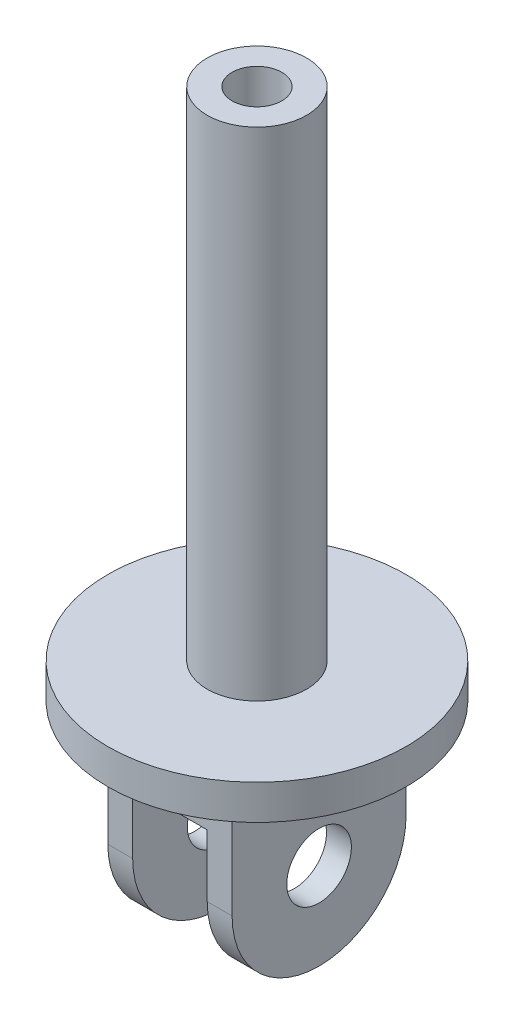
ISO-10303-21;
HEADER;
FILE_DESCRIPTION(('STEP AP214'),'2;1');
FILE_NAME('part.step','',(''),(''),'','','');
FILE_SCHEMA(('AUTOMOTIVE_DESIGN { 1 0 10303 214 1 1 1 1 }'));
ENDSEC;
DATA;
#1=APPLICATION_CONTEXT('core data for automotive mechanical design processes');
#2=APPLICATION_PROTOCOL_DEFINITION('international standard','automotive_design',2000,#1);
#3=PRODUCT_CONTEXT('',#1,'mechanical');
#4=PRODUCT('Part','Part','',(#3));
#5=PRODUCT_RELATED_PRODUCT_CATEGORY('part','',(#4));
#6=PRODUCT_DEFINITION_FORMATION('','',#4);
#7=PRODUCT_DEFINITION_CONTEXT('part definition',#1,'design');
#8=PRODUCT_DEFINITION('design','',#6,#7);
#9=PRODUCT_DEFINITION_SHAPE('','',#8);
#10=(LENGTH_UNIT() NAMED_UNIT(*) SI_UNIT(.MILLI.,.METRE.));
#11=(NAMED_UNIT(*) PLANE_ANGLE_UNIT() SI_UNIT($,.RADIAN.));
#12=(NAMED_UNIT(*) SI_UNIT($,.STERADIAN.) SOLID_ANGLE_UNIT());
#13=UNCERTAINTY_MEASURE_WITH_UNIT(LENGTH_MEASURE(1.E-05),#10,'distance_accuracy_value','');
#14=(GEOMETRIC_REPRESENTATION_CONTEXT(3) GLOBAL_UNCERTAINTY_ASSIGNED_CONTEXT((#13)) GLOBAL_UNIT_ASSIGNED_CONTEXT((#10,
#11,#12)) REPRESENTATION_CONTEXT('',''));
#15=CARTESIAN_POINT('',(0.,0.,0.));
#16=DIRECTION('',(0.,0.,1.));
#17=DIRECTION('',(1.,0.,0.));
#18=AXIS2_PLACEMENT_3D('',#15,#16,#17);
#19=CARTESIAN_POINT('',(-12.5,17.5,0.));
#20=DIRECTION('',(1.,0.,0.));
#21=DIRECTION('',(0.,0.,-1.));
#22=AXIS2_PLACEMENT_3D('',#19,#20,#21);
#23=CYLINDRICAL_SURFACE('',#22,17.5);
#24=DIRECTION('',(1.,0.,0.));
#25=VECTOR('',#24,1.);
#26=CARTESIAN_POINT('',(-12.5,17.5,17.5));
#27=LINE('',#26,#25);
#28=CARTESIAN_POINT('',(7.5,17.5,17.5));
#29=VERTEX_POINT('',#28);
#30=CARTESIAN_POINT('',(12.5,17.5,17.5));
#31=VERTEX_POINT('',#30);
#32=EDGE_CURVE('E126',#29,#31,#27,.T.);
#33=ORIENTED_EDGE('',*,*,#32,.F.);
#34=CARTESIAN_POINT('',(7.5,17.5,0.));
#35=DIRECTION('',(-1.,0.,0.));
#36=DIRECTION('',(0.,0.,1.));
#37=AXIS2_PLACEMENT_3D('',#34,#35,#36);
#38=CIRCLE('',#37,17.5);
#39=CARTESIAN_POINT('',(7.5,17.5,-17.5));
#40=VERTEX_POINT('',#39);
#41=EDGE_CURVE('E116',#29,#40,#38,.F.);
#42=ORIENTED_EDGE('',*,*,#41,.T.);
#43=DIRECTION('',(1.,0.,0.));
#44=VECTOR('',#43,1.);
#45=CARTESIAN_POINT('',(-12.5,17.5,-17.5));
#46=LINE('',#45,#44);
#47=CARTESIAN_POINT('',(12.5,17.5,-17.5));
#48=VERTEX_POINT('',#47);
#49=EDGE_CURVE('E145',#48,#40,#46,.F.);
#50=ORIENTED_EDGE('',*,*,#49,.F.);
#51=CARTESIAN_POINT('',(12.5,17.5,0.));
#52=DIRECTION('',(-1.,0.,0.));
#53=DIRECTION('',(0.,0.,1.));
#54=AXIS2_PLACEMENT_3D('',#51,#52,#53);
#55=CIRCLE('',#54,17.5);
#56=EDGE_CURVE('E49',#31,#48,#55,.F.);
#57=ORIENTED_EDGE('',*,*,#56,.F.);
#58=EDGE_LOOP('',(#33,#42,#50,#57));
#59=FACE_BOUND('',#58,.T.);
#60=ADVANCED_FACE('F41',(#59),#23,.T.);
#61=CARTESIAN_POINT('',(-7.5,17.5,-17.5));
#62=VERTEX_POINT('',#61);
#63=CARTESIAN_POINT('',(-12.5,17.5,-17.5));
#64=VERTEX_POINT('',#63);
#65=EDGE_CURVE('E144',#62,#64,#46,.F.);
#66=ORIENTED_EDGE('',*,*,#65,.F.);
#67=CARTESIAN_POINT('',(-7.5,17.5,0.));
#68=DIRECTION('',(1.,0.,0.));
#69=DIRECTION('',(0.,0.,-1.));
#70=AXIS2_PLACEMENT_3D('',#67,#68,#69);
#71=CIRCLE('',#70,17.5);
#72=CARTESIAN_POINT('',(-7.5,17.5,17.5));
#73=VERTEX_POINT('',#72);
#74=EDGE_CURVE('E191',#62,#73,#71,.F.);
#75=ORIENTED_EDGE('',*,*,#74,.T.);
#76=CARTESIAN_POINT('',(-12.5,17.5,17.5));
#77=VERTEX_POINT('',#76);
#78=EDGE_CURVE('E141',#77,#73,#27,.T.);
#79=ORIENTED_EDGE('',*,*,#78,.F.);
#80=CARTESIAN_POINT('',(-12.5,17.5,0.));
#81=DIRECTION('',(1.,0.,0.));
#82=DIRECTION('',(0.,0.,-1.));
#83=AXIS2_PLACEMENT_3D('',#80,#81,#82);
#84=CIRCLE('',#83,17.5);
#85=EDGE_CURVE('E148',#64,#77,#84,.F.);
#86=ORIENTED_EDGE('',*,*,#85,.F.);
#87=EDGE_LOOP('',(#66,#75,#79,#86));
#88=FACE_BOUND('',#87,.T.);
#89=ADVANCED_FACE('F203',(#88),#23,.T.);
#90=CARTESIAN_POINT('',(-12.5,40.,-17.5));
#91=DIRECTION('',(0.,0.,1.));
#92=DIRECTION('',(1.,0.,0.));
#93=AXIS2_PLACEMENT_3D('',#90,#91,#92);
#94=PLANE('',#93);
#95=DIRECTION('',(0.,-1.,0.));
#96=VECTOR('',#95,1.);
#97=CARTESIAN_POINT('',(7.5,30.,-17.5));
#98=LINE('',#97,#96);
#99=CARTESIAN_POINT('',(7.5,30.,-17.5));
#100=VERTEX_POINT('',#99);
#101=EDGE_CURVE('E188',#100,#40,#98,.T.);
#102=ORIENTED_EDGE('',*,*,#101,.F.);
#103=DIRECTION('',(-1.,0.,0.));
#104=VECTOR('',#103,1.);
#105=CARTESIAN_POINT('',(-7.5,30.,-17.5));
#106=LINE('',#105,#104);
#107=CARTESIAN_POINT('',(-7.5,30.,-17.5));
#108=VERTEX_POINT('',#107);
#109=EDGE_CURVE('E172',#100,#108,#106,.T.);
#110=ORIENTED_EDGE('',*,*,#109,.T.);
#111=DIRECTION('',(0.,-1.,0.));
#112=VECTOR('',#111,1.);
#113=CARTESIAN_POINT('',(-7.5,30.,-17.5));
#114=LINE('',#113,#112);
#115=EDGE_CURVE('E185',#108,#62,#114,.T.);
#116=ORIENTED_EDGE('',*,*,#115,.T.);
#117=ORIENTED_EDGE('',*,*,#65,.T.);
#118=DIRECTION('',(0.,-1.,0.));
#119=VECTOR('',#118,1.);
#120=CARTESIAN_POINT('',(-12.5,40.,-17.5));
#121=LINE('',#120,#119);
#122=CARTESIAN_POINT('',(-12.5,40.,-17.5));
#123=VERTEX_POINT('',#122);
#124=EDGE_CURVE('E137',#123,#64,#121,.T.);
#125=ORIENTED_EDGE('',*,*,#124,.F.);
#126=DIRECTION('',(-1.,0.,0.));
#127=VECTOR('',#126,1.);
#128=CARTESIAN_POINT('',(-12.5,40.,-17.5));
#129=LINE('',#128,#127);
#130=CARTESIAN_POINT('',(12.5,40.,-17.5));
#131=VERTEX_POINT('',#130);
#132=EDGE_CURVE('E115',#131,#123,#129,.T.);
#133=ORIENTED_EDGE('',*,*,#132,.F.);
#134=DIRECTION('',(0.,-1.,0.));
#135=VECTOR('',#134,1.);
#136=CARTESIAN_POINT('',(12.5,40.,-17.5));
#137=LINE('',#136,#135);
#138=EDGE_CURVE('E111',#131,#48,#137,.T.);
#139=ORIENTED_EDGE('',*,*,#138,.T.);
#140=ORIENTED_EDGE('',*,*,#49,.T.);
#141=EDGE_LOOP('',(#102,#110,#116,#117,#125,#133,#139,#140));
#142=FACE_BOUND('',#141,.T.);
#143=ADVANCED_FACE('F195',(#142),#94,.F.);
#144=CARTESIAN_POINT('',(-12.5,40.,17.5));
#145=DIRECTION('',(0.,0.,-1.));
#146=DIRECTION('',(-1.,0.,0.));
#147=AXIS2_PLACEMENT_3D('',#144,#145,#146);
#148=PLANE('',#147);
#149=DIRECTION('',(0.,-1.,0.));
#150=VECTOR('',#149,1.);
#151=CARTESIAN_POINT('',(7.5,30.,17.5));
#152=LINE('',#151,#150);
#153=CARTESIAN_POINT('',(7.5,30.,17.5));
#154=VERTEX_POINT('',#153);
#155=EDGE_CURVE('E180',#154,#29,#152,.T.);
#156=ORIENTED_EDGE('',*,*,#155,.T.);
#157=ORIENTED_EDGE('',*,*,#32,.T.);
#158=DIRECTION('',(0.,-1.,0.));
#159=VECTOR('',#158,1.);
#160=CARTESIAN_POINT('',(12.5,40.,17.5));
#161=LINE('',#160,#159);
#162=CARTESIAN_POINT('',(12.5,40.,17.5));
#163=VERTEX_POINT('',#162);
#164=EDGE_CURVE('E109',#163,#31,#161,.T.);
#165=ORIENTED_EDGE('',*,*,#164,.F.);
#166=DIRECTION('',(1.,0.,0.));
#167=VECTOR('',#166,1.);
#168=CARTESIAN_POINT('',(-12.5,40.,17.5));
#169=LINE('',#168,#167);
#170=CARTESIAN_POINT('',(-12.5,40.,17.5));
#171=VERTEX_POINT('',#170);
#172=EDGE_CURVE('E123',#171,#163,#169,.T.);
#173=ORIENTED_EDGE('',*,*,#172,.F.);
#174=DIRECTION('',(0.,-1.,0.));
#175=VECTOR('',#174,1.);
#176=CARTESIAN_POINT('',(-12.5,40.,17.5));
#177=LINE('',#176,#175);
#178=EDGE_CURVE('E127',#171,#77,#177,.T.);
#179=ORIENTED_EDGE('',*,*,#178,.T.);
#180=ORIENTED_EDGE('',*,*,#78,.T.);
#181=DIRECTION('',(0.,-1.,0.));
#182=VECTOR('',#181,1.);
#183=CARTESIAN_POINT('',(-7.5,30.,17.5));
#184=LINE('',#183,#182);
#185=CARTESIAN_POINT('',(-7.5,30.,17.5));
#186=VERTEX_POINT('',#185);
#187=EDGE_CURVE('E182',#186,#73,#184,.T.);
#188=ORIENTED_EDGE('',*,*,#187,.F.);
#189=DIRECTION('',(1.,0.,0.));
#190=VECTOR('',#189,1.);
#191=CARTESIAN_POINT('',(-7.5,30.,17.5));
#192=LINE('',#191,#190);
#193=EDGE_CURVE('E177',#186,#154,#192,.T.);
#194=ORIENTED_EDGE('',*,*,#193,.T.);
#195=EDGE_LOOP('',(#156,#157,#165,#173,#179,#180,#188,#194));
#196=FACE_BOUND('',#195,.T.);
#197=ADVANCED_FACE('F121',(#196),#148,.F.);
#198=CARTESIAN_POINT('',(12.5,40.,-17.5));
#199=DIRECTION('',(-1.,0.,0.));
#200=DIRECTION('',(0.,0.,1.));
#201=AXIS2_PLACEMENT_3D('',#198,#199,#200);
#202=PLANE('',#201);
#203=CARTESIAN_POINT('',(12.5,17.5,0.));
#204=DIRECTION('',(-1.,0.,0.));
#205=DIRECTION('',(0.,0.,1.));
#206=AXIS2_PLACEMENT_3D('',#203,#204,#205);
#207=CIRCLE('',#206,6.5);
#208=CARTESIAN_POINT('',(12.5,17.5,6.5));
#209=VERTEX_POINT('',#208);
#210=EDGE_CURVE('E157',#209,#209,#207,.T.);
#211=ORIENTED_EDGE('',*,*,#210,.T.);
#212=EDGE_LOOP('',(#211));
#213=FACE_BOUND('',#212,.T.);
#214=ORIENTED_EDGE('',*,*,#164,.T.);
#215=ORIENTED_EDGE('',*,*,#56,.T.);
#216=ORIENTED_EDGE('',*,*,#138,.F.);
#217=DIRECTION('',(0.,0.,-1.));
#218=VECTOR('',#217,1.);
#219=CARTESIAN_POINT('',(12.5,40.,-17.5));
#220=LINE('',#219,#218);
#221=EDGE_CURVE('E106',#163,#131,#220,.T.);
#222=ORIENTED_EDGE('',*,*,#221,.F.);
#223=EDGE_LOOP('',(#214,#215,#216,#222));
#224=FACE_BOUND('',#223,.T.);
#225=ADVANCED_FACE('F108',(#213,#224),#202,.F.);
#226=CARTESIAN_POINT('',(-12.5,40.,-17.5));
#227=DIRECTION('',(1.,0.,0.));
#228=DIRECTION('',(0.,0.,-1.));
#229=AXIS2_PLACEMENT_3D('',#226,#227,#228);
#230=PLANE('',#229);
#231=CARTESIAN_POINT('',(-12.5,17.5,0.));
#232=DIRECTION('',(-1.,0.,0.));
#233=DIRECTION('',(0.,0.,1.));
#234=AXIS2_PLACEMENT_3D('',#231,#232,#233);
#235=CIRCLE('',#234,6.5);
#236=CARTESIAN_POINT('',(-12.5,17.5,6.50000000000001));
#237=VERTEX_POINT('',#236);
#238=EDGE_CURVE('E153',#237,#237,#235,.T.);
#239=ORIENTED_EDGE('',*,*,#238,.F.);
#240=EDGE_LOOP('',(#239));
#241=FACE_BOUND('',#240,.T.);
#242=ORIENTED_EDGE('',*,*,#124,.T.);
#243=ORIENTED_EDGE('',*,*,#85,.T.);
#244=ORIENTED_EDGE('',*,*,#178,.F.);
#245=DIRECTION('',(0.,0.,1.));
#246=VECTOR('',#245,1.);
#247=CARTESIAN_POINT('',(-12.5,40.,-17.5));
#248=LINE('',#247,#246);
#249=EDGE_CURVE('E131',#123,#171,#248,.T.);
#250=ORIENTED_EDGE('',*,*,#249,.F.);
#251=EDGE_LOOP('',(#242,#243,#244,#250));
#252=FACE_BOUND('',#251,.T.);
#253=ADVANCED_FACE('F199',(#241,#252),#230,.F.);
#254=CARTESIAN_POINT('',(7.5,30.,17.5));
#255=DIRECTION('',(-1.,0.,0.));
#256=DIRECTION('',(0.,0.,1.));
#257=AXIS2_PLACEMENT_3D('',#254,#255,#256);
#258=PLANE('',#257);
#259=CARTESIAN_POINT('',(7.5,17.5,0.));
#260=DIRECTION('',(-1.,0.,0.));
#261=DIRECTION('',(0.,0.,1.));
#262=AXIS2_PLACEMENT_3D('',#259,#260,#261);
#263=CIRCLE('',#262,6.5);
#264=CARTESIAN_POINT('',(7.5,17.5,6.50000000000001));
#265=VERTEX_POINT('',#264);
#266=EDGE_CURVE('E152',#265,#265,#263,.T.);
#267=ORIENTED_EDGE('',*,*,#266,.F.);
#268=EDGE_LOOP('',(#267));
#269=FACE_BOUND('',#268,.T.);
#270=ORIENTED_EDGE('',*,*,#155,.F.);
#271=DIRECTION('',(0.,0.,-1.));
#272=VECTOR('',#271,1.);
#273=CARTESIAN_POINT('',(7.5,30.,17.5));
#274=LINE('',#273,#272);
#275=EDGE_CURVE('E56',#154,#100,#274,.T.);
#276=ORIENTED_EDGE('',*,*,#275,.T.);
#277=ORIENTED_EDGE('',*,*,#101,.T.);
#278=ORIENTED_EDGE('',*,*,#41,.F.);
#279=EDGE_LOOP('',(#270,#276,#277,#278));
#280=FACE_BOUND('',#279,.T.);
#281=ADVANCED_FACE('F210',(#269,#280),#258,.T.);
#282=CARTESIAN_POINT('',(-7.5,30.,17.5));
#283=DIRECTION('',(1.,0.,0.));
#284=DIRECTION('',(0.,0.,-1.));
#285=AXIS2_PLACEMENT_3D('',#282,#283,#284);
#286=PLANE('',#285);
#287=CARTESIAN_POINT('',(-7.5,17.5,0.));
#288=DIRECTION('',(1.,0.,0.));
#289=DIRECTION('',(0.,0.,-1.));
#290=AXIS2_PLACEMENT_3D('',#287,#288,#289);
#291=CIRCLE('',#290,6.5);
#292=CARTESIAN_POINT('',(-7.5,17.5,-6.49999999999999));
#293=VERTEX_POINT('',#292);
#294=EDGE_CURVE('E150',#293,#293,#291,.T.);
#295=ORIENTED_EDGE('',*,*,#294,.F.);
#296=EDGE_LOOP('',(#295));
#297=FACE_BOUND('',#296,.T.);
#298=ORIENTED_EDGE('',*,*,#115,.F.);
#299=DIRECTION('',(0.,0.,1.));
#300=VECTOR('',#299,1.);
#301=CARTESIAN_POINT('',(-7.5,30.,17.5));
#302=LINE('',#301,#300);
#303=EDGE_CURVE('E175',#108,#186,#302,.T.);
#304=ORIENTED_EDGE('',*,*,#303,.T.);
#305=ORIENTED_EDGE('',*,*,#187,.T.);
#306=ORIENTED_EDGE('',*,*,#74,.F.);
#307=EDGE_LOOP('',(#298,#304,#305,#306));
#308=FACE_BOUND('',#307,.T.);
#309=ADVANCED_FACE('F205',(#297,#308),#286,.T.);
#310=CARTESIAN_POINT('',(0.,30.,0.));
#311=DIRECTION('',(0.,-1.,0.));
#312=DIRECTION('',(0.,0.,-1.));
#313=AXIS2_PLACEMENT_3D('',#310,#311,#312);
#314=PLANE('',#313);
#315=ORIENTED_EDGE('',*,*,#275,.F.);
#316=ORIENTED_EDGE('',*,*,#193,.F.);
#317=ORIENTED_EDGE('',*,*,#303,.F.);
#318=ORIENTED_EDGE('',*,*,#109,.F.);
#319=EDGE_LOOP('',(#315,#316,#317,#318));
#320=FACE_BOUND('',#319,.T.);
#321=ADVANCED_FACE('F207',(#320),#314,.T.);
#322=CARTESIAN_POINT('',(17.5,17.5,0.));
#323=DIRECTION('',(-1.,0.,0.));
#324=DIRECTION('',(0.,0.,1.));
#325=AXIS2_PLACEMENT_3D('',#322,#323,#324);
#326=CYLINDRICAL_SURFACE('',#325,6.5);
#327=ORIENTED_EDGE('',*,*,#294,.T.);
#328=EDGE_LOOP('',(#327));
#329=FACE_BOUND('',#328,.T.);
#330=ORIENTED_EDGE('',*,*,#238,.T.);
#331=EDGE_LOOP('',(#330));
#332=FACE_BOUND('',#331,.T.);
#333=ADVANCED_FACE('F243',(#329,#332),#326,.F.);
#334=ORIENTED_EDGE('',*,*,#266,.T.);
#335=EDGE_LOOP('',(#334));
#336=FACE_BOUND('',#335,.T.);
#337=ORIENTED_EDGE('',*,*,#210,.F.);
#338=EDGE_LOOP('',(#337));
#339=FACE_BOUND('',#338,.T.);
#340=ADVANCED_FACE('F241',(#336,#339),#326,.F.);
#341=CARTESIAN_POINT('',(0.,40.,0.));
#342=DIRECTION('',(0.,1.,0.));
#343=DIRECTION('',(0.,0.,1.));
#344=AXIS2_PLACEMENT_3D('',#341,#342,#343);
#345=PLANE('',#344);
#346=CARTESIAN_POINT('',(0.,40.,0.));
#347=DIRECTION('',(0.,1.,0.));
#348=DIRECTION('',(0.,0.,1.));
#349=AXIS2_PLACEMENT_3D('',#346,#347,#348);
#350=CIRCLE('',#349,30.);
#351=CARTESIAN_POINT('',(0.,40.,30.));
#352=VERTEX_POINT('',#351);
#353=EDGE_CURVE('E165',#352,#352,#350,.T.);
#354=ORIENTED_EDGE('',*,*,#353,.F.);
#355=EDGE_LOOP('',(#354));
#356=FACE_BOUND('',#355,.T.);
#357=ORIENTED_EDGE('',*,*,#172,.T.);
#358=ORIENTED_EDGE('',*,*,#221,.T.);
#359=ORIENTED_EDGE('',*,*,#132,.T.);
#360=ORIENTED_EDGE('',*,*,#249,.T.);
#361=EDGE_LOOP('',(#357,#358,#359,#360));
#362=FACE_BOUND('',#361,.T.);
#363=ADVANCED_FACE('F129',(#356,#362),#345,.F.);
#364=CARTESIAN_POINT('',(0.,47.,0.));
#365=DIRECTION('',(0.,-1.,0.));
#366=DIRECTION('',(0.,0.,-1.));
#367=AXIS2_PLACEMENT_3D('',#364,#365,#366);
#368=CYLINDRICAL_SURFACE('',#367,30.);
#369=CARTESIAN_POINT('',(0.,47.,0.));
#370=DIRECTION('',(0.,1.,0.));
#371=DIRECTION('',(0.,0.,1.));
#372=AXIS2_PLACEMENT_3D('',#369,#370,#371);
#373=CIRCLE('',#372,30.);
#374=CARTESIAN_POINT('',(0.,47.,30.));
#375=VERTEX_POINT('',#374);
#376=EDGE_CURVE('E160',#375,#375,#373,.T.);
#377=ORIENTED_EDGE('',*,*,#376,.F.);
#378=EDGE_LOOP('',(#377));
#379=FACE_BOUND('',#378,.T.);
#380=ORIENTED_EDGE('',*,*,#353,.T.);
#381=EDGE_LOOP('',(#380));
#382=FACE_BOUND('',#381,.T.);
#383=ADVANCED_FACE('F250',(#379,#382),#368,.T.);
#384=CARTESIAN_POINT('',(0.,47.,0.));
#385=DIRECTION('',(0.,1.,0.));
#386=DIRECTION('',(0.,0.,1.));
#387=AXIS2_PLACEMENT_3D('',#384,#385,#386);
#388=PLANE('',#387);
#389=CARTESIAN_POINT('',(0.,47.,0.));
#390=DIRECTION('',(0.,1.,0.));
#391=DIRECTION('',(0.,0.,1.));
#392=AXIS2_PLACEMENT_3D('',#389,#390,#391);
#393=CIRCLE('',#392,10.);
#394=CARTESIAN_POINT('',(0.,47.,10.));
#395=VERTEX_POINT('',#394);
#396=EDGE_CURVE('E364',#395,#395,#393,.T.);
#397=ORIENTED_EDGE('',*,*,#396,.F.);
#398=EDGE_LOOP('',(#397));
#399=FACE_BOUND('',#398,.T.);
#400=ORIENTED_EDGE('',*,*,#376,.T.);
#401=EDGE_LOOP('',(#400));
#402=FACE_BOUND('',#401,.T.);
#403=ADVANCED_FACE('F306',(#399,#402),#388,.T.);
#404=CARTESIAN_POINT('',(0.,147.,0.));
#405=DIRECTION('',(0.,1.,0.));
#406=DIRECTION('',(0.,0.,1.));
#407=AXIS2_PLACEMENT_3D('',#404,#405,#406);
#408=PLANE('',#407);
#409=CARTESIAN_POINT('',(0.,147.,0.));
#410=DIRECTION('',(0.,1.,0.));
#411=DIRECTION('',(0.,0.,1.));
#412=AXIS2_PLACEMENT_3D('',#409,#410,#411);
#413=CIRCLE('',#412,10.);
#414=CARTESIAN_POINT('',(0.,147.,10.));
#415=VERTEX_POINT('',#414);
#416=EDGE_CURVE('E367',#415,#415,#413,.T.);
#417=ORIENTED_EDGE('',*,*,#416,.T.);
#418=EDGE_LOOP('',(#417));
#419=FACE_BOUND('',#418,.T.);
#420=CARTESIAN_POINT('',(0.,147.,0.));
#421=DIRECTION('',(0.,1.,0.));
#422=DIRECTION('',(0.,0.,1.));
#423=AXIS2_PLACEMENT_3D('',#420,#421,#422);
#424=CIRCLE('',#423,5.);
#425=CARTESIAN_POINT('',(0.,147.,5.));
#426=VERTEX_POINT('',#425);
#427=EDGE_CURVE('E362',#426,#426,#424,.T.);
#428=ORIENTED_EDGE('',*,*,#427,.F.);
#429=EDGE_LOOP('',(#428));
#430=FACE_BOUND('',#429,.T.);
#431=ADVANCED_FACE('F315',(#419,#430),#408,.T.);
#432=CARTESIAN_POINT('',(0.,147.,0.));
#433=DIRECTION('',(0.,-1.,0.));
#434=DIRECTION('',(0.,0.,-1.));
#435=AXIS2_PLACEMENT_3D('',#432,#433,#434);
#436=CYLINDRICAL_SURFACE('',#435,10.);
#437=ORIENTED_EDGE('',*,*,#416,.F.);
#438=EDGE_LOOP('',(#437));
#439=FACE_BOUND('',#438,.T.);
#440=ORIENTED_EDGE('',*,*,#396,.T.);
#441=EDGE_LOOP('',(#440));
#442=FACE_BOUND('',#441,.T.);
#443=ADVANCED_FACE('F327',(#439,#442),#436,.T.);
#444=CARTESIAN_POINT('',(0.,147.,0.));
#445=DIRECTION('',(0.,-1.,0.));
#446=DIRECTION('',(0.,0.,-1.));
#447=AXIS2_PLACEMENT_3D('',#444,#445,#446);
#448=CYLINDRICAL_SURFACE('',#447,5.);
#449=ORIENTED_EDGE('',*,*,#427,.T.);
#450=EDGE_LOOP('',(#449));
#451=FACE_BOUND('',#450,.T.);
#452=CARTESIAN_POINT('',(0.,47.,0.));
#453=DIRECTION('',(0.,1.,0.));
#454=DIRECTION('',(0.,0.,1.));
#455=AXIS2_PLACEMENT_3D('',#452,#453,#454);
#456=CIRCLE('',#455,5.);
#457=CARTESIAN_POINT('',(0.,47.,5.));
#458=VERTEX_POINT('',#457);
#459=EDGE_CURVE('E11',#458,#458,#456,.F.);
#460=ORIENTED_EDGE('',*,*,#459,.T.);
#461=EDGE_LOOP('',(#460));
#462=FACE_BOUND('',#461,.T.);
#463=ADVANCED_FACE('F337',(#451,#462),#448,.F.);
#464=ORIENTED_EDGE('',*,*,#459,.F.);
#465=EDGE_LOOP('',(#464));
#466=FACE_BOUND('',#465,.T.);
#467=ADVANCED_FACE('F318',(#466),#388,.T.);
#468=CLOSED_SHELL('',(#60,#89,#143,#197,#225,#253,#281,#309,#321,#333,#340,#363,#383,#403,#431,
#443,#463,#467));
#469=MANIFOLD_SOLID_BREP('B2',#468);
#470=ADVANCED_BREP_SHAPE_REPRESENTATION('',(#18,#469),#14);
#471=SHAPE_DEFINITION_REPRESENTATION(#9,#470);
ENDSEC;
END-ISO-10303-21;
